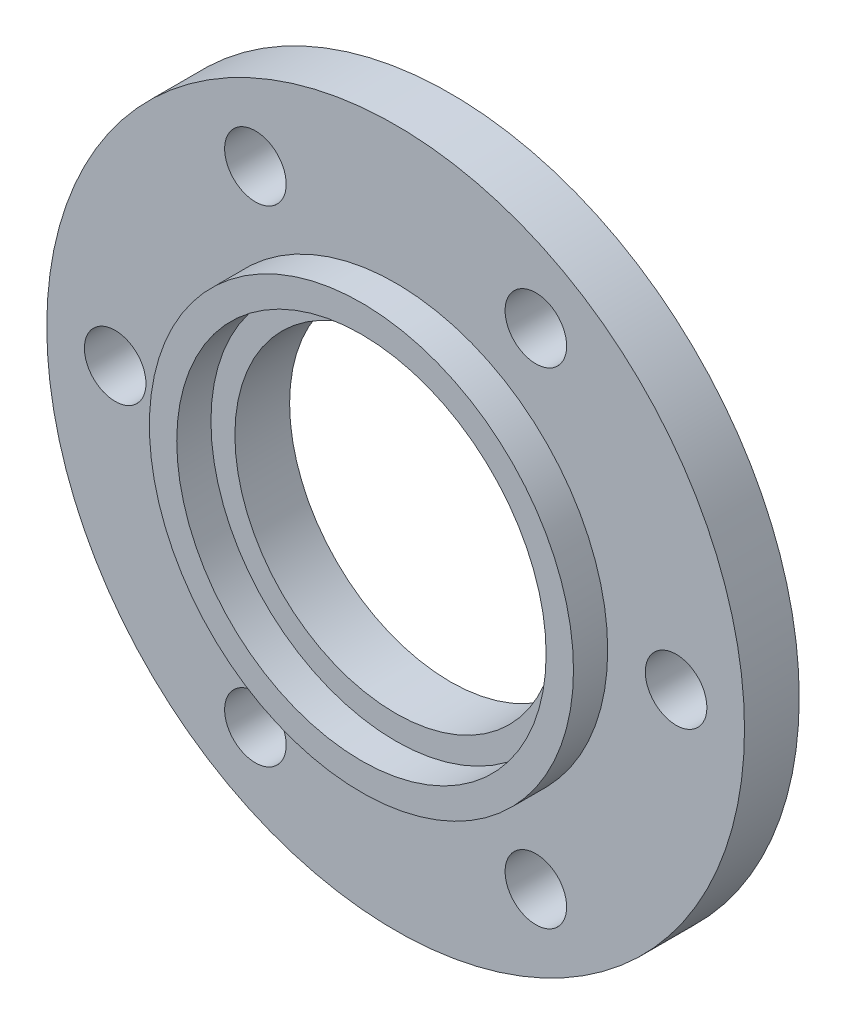
ISO-10303-21;
HEADER;
FILE_DESCRIPTION(('STEP AP214'),'2;1');
FILE_NAME('part.step','',(''),(''),'','','');
FILE_SCHEMA(('AUTOMOTIVE_DESIGN { 1 0 10303 214 1 1 1 1 }'));
ENDSEC;
DATA;
#1=APPLICATION_CONTEXT('core data for automotive mechanical design processes');
#2=APPLICATION_PROTOCOL_DEFINITION('international standard','automotive_design',2000,#1);
#3=PRODUCT_CONTEXT('',#1,'mechanical');
#4=PRODUCT('Part','Part','',(#3));
#5=PRODUCT_RELATED_PRODUCT_CATEGORY('part','',(#4));
#6=PRODUCT_DEFINITION_FORMATION('','',#4);
#7=PRODUCT_DEFINITION_CONTEXT('part definition',#1,'design');
#8=PRODUCT_DEFINITION('design','',#6,#7);
#9=PRODUCT_DEFINITION_SHAPE('','',#8);
#10=(LENGTH_UNIT() NAMED_UNIT(*) SI_UNIT(.MILLI.,.METRE.));
#11=(NAMED_UNIT(*) PLANE_ANGLE_UNIT() SI_UNIT($,.RADIAN.));
#12=(NAMED_UNIT(*) SI_UNIT($,.STERADIAN.) SOLID_ANGLE_UNIT());
#13=UNCERTAINTY_MEASURE_WITH_UNIT(LENGTH_MEASURE(1.E-05),#10,'distance_accuracy_value','');
#14=(GEOMETRIC_REPRESENTATION_CONTEXT(3) GLOBAL_UNCERTAINTY_ASSIGNED_CONTEXT((#13)) GLOBAL_UNIT_ASSIGNED_CONTEXT((#10,
#11,#12)) REPRESENTATION_CONTEXT('',''));
#15=CARTESIAN_POINT('',(0.,0.,0.));
#16=DIRECTION('',(0.,0.,1.));
#17=DIRECTION('',(1.,0.,0.));
#18=AXIS2_PLACEMENT_3D('',#15,#16,#17);
#19=CARTESIAN_POINT('',(0.,0.,8.));
#20=DIRECTION('',(0.,0.,1.));
#21=DIRECTION('',(1.,0.,0.));
#22=AXIS2_PLACEMENT_3D('',#19,#20,#21);
#23=PLANE('',#22);
#24=CARTESIAN_POINT('',(0.,0.,8.));
#25=DIRECTION('',(0.,0.,1.));
#26=DIRECTION('',(1.,0.,0.));
#27=AXIS2_PLACEMENT_3D('',#24,#25,#26);
#28=CIRCLE('',#27,23.5);
#29=CARTESIAN_POINT('',(23.5,0.,8.));
#30=VERTEX_POINT('',#29);
#31=EDGE_CURVE('E55',#30,#30,#28,.T.);
#32=ORIENTED_EDGE('',*,*,#31,.F.);
#33=EDGE_LOOP('',(#32));
#34=FACE_BOUND('',#33,.T.);
#35=CARTESIAN_POINT('',(0.,0.,8.));
#36=DIRECTION('',(0.,0.,1.));
#37=DIRECTION('',(1.,0.,0.));
#38=AXIS2_PLACEMENT_3D('',#35,#36,#37);
#39=CIRCLE('',#38,27.);
#40=CARTESIAN_POINT('',(27.,0.,8.));
#41=VERTEX_POINT('',#40);
#42=EDGE_CURVE('E10',#41,#41,#39,.F.);
#43=ORIENTED_EDGE('',*,*,#42,.F.);
#44=EDGE_LOOP('',(#43));
#45=FACE_BOUND('',#44,.T.);
#46=ADVANCED_FACE('F39',(#34,#45),#23,.T.);
#47=CARTESIAN_POINT('',(41.,0.,8.));
#48=DIRECTION('',(0.,0.,1.));
#49=DIRECTION('',(1.,0.,0.));
#50=AXIS2_PLACEMENT_3D('',#47,#48,#49);
#51=CIRCLE('',#50,4.5);
#52=CARTESIAN_POINT('',(45.5,0.,8.));
#53=VERTEX_POINT('',#52);
#54=EDGE_CURVE('E95',#53,#53,#51,.T.);
#55=ORIENTED_EDGE('',*,*,#54,.F.);
#56=EDGE_LOOP('',(#55));
#57=FACE_BOUND('',#56,.T.);
#58=CARTESIAN_POINT('',(20.5000000000004,35.5070415551617,8.));
#59=DIRECTION('',(0.,0.,1.));
#60=DIRECTION('',(1.,0.,0.));
#61=AXIS2_PLACEMENT_3D('',#58,#59,#60);
#62=CIRCLE('',#61,4.5);
#63=CARTESIAN_POINT('',(25.0000000000004,35.5070415551617,8.));
#64=VERTEX_POINT('',#63);
#65=EDGE_CURVE('E79',#64,#64,#62,.T.);
#66=ORIENTED_EDGE('',*,*,#65,.F.);
#67=EDGE_LOOP('',(#66));
#68=FACE_BOUND('',#67,.T.);
#69=CARTESIAN_POINT('',(-20.4999999999997,35.5070415551622,8.));
#70=DIRECTION('',(0.,0.,1.));
#71=DIRECTION('',(1.,0.,0.));
#72=AXIS2_PLACEMENT_3D('',#69,#70,#71);
#73=CIRCLE('',#72,4.5);
#74=CARTESIAN_POINT('',(-15.9999999999997,35.5070415551622,8.));
#75=VERTEX_POINT('',#74);
#76=EDGE_CURVE('E72',#75,#75,#73,.T.);
#77=ORIENTED_EDGE('',*,*,#76,.F.);
#78=EDGE_LOOP('',(#77));
#79=FACE_BOUND('',#78,.T.);
#80=CARTESIAN_POINT('',(-41.,2.86301469785137E-13,8.));
#81=DIRECTION('',(0.,0.,1.));
#82=DIRECTION('',(1.,0.,0.));
#83=AXIS2_PLACEMENT_3D('',#80,#81,#82);
#84=CIRCLE('',#83,4.5);
#85=CARTESIAN_POINT('',(-36.5,2.86301469785137E-13,8.));
#86=VERTEX_POINT('',#85);
#87=EDGE_CURVE('E80',#86,#86,#84,.T.);
#88=ORIENTED_EDGE('',*,*,#87,.F.);
#89=EDGE_LOOP('',(#88));
#90=FACE_BOUND('',#89,.T.);
#91=CARTESIAN_POINT('',(-20.5000000000002,-35.5070415551619,8.));
#92=DIRECTION('',(0.,0.,1.));
#93=DIRECTION('',(1.,0.,0.));
#94=AXIS2_PLACEMENT_3D('',#91,#92,#93);
#95=CIRCLE('',#94,4.5);
#96=CARTESIAN_POINT('',(-16.0000000000002,-35.5070415551619,8.));
#97=VERTEX_POINT('',#96);
#98=EDGE_CURVE('E86',#97,#97,#95,.T.);
#99=ORIENTED_EDGE('',*,*,#98,.F.);
#100=EDGE_LOOP('',(#99));
#101=FACE_BOUND('',#100,.T.);
#102=CARTESIAN_POINT('',(20.4999999999999,-35.507041555162,8.));
#103=DIRECTION('',(0.,0.,1.));
#104=DIRECTION('',(1.,0.,0.));
#105=AXIS2_PLACEMENT_3D('',#102,#103,#104);
#106=CIRCLE('',#105,4.5);
#107=CARTESIAN_POINT('',(24.9999999999999,-35.507041555162,8.));
#108=VERTEX_POINT('',#107);
#109=EDGE_CURVE('E92',#108,#108,#106,.T.);
#110=ORIENTED_EDGE('',*,*,#109,.F.);
#111=EDGE_LOOP('',(#110));
#112=FACE_BOUND('',#111,.T.);
#113=CARTESIAN_POINT('',(0.,0.,8.));
#114=DIRECTION('',(0.,0.,1.));
#115=DIRECTION('',(1.,0.,0.));
#116=AXIS2_PLACEMENT_3D('',#113,#114,#115);
#117=CIRCLE('',#116,31.);
#118=CARTESIAN_POINT('',(31.,0.,8.));
#119=VERTEX_POINT('',#118);
#120=EDGE_CURVE('E63',#119,#119,#117,.T.);
#121=ORIENTED_EDGE('',*,*,#120,.F.);
#122=EDGE_LOOP('',(#121));
#123=FACE_BOUND('',#122,.T.);
#124=CARTESIAN_POINT('',(0.,0.,8.));
#125=DIRECTION('',(0.,0.,1.));
#126=DIRECTION('',(1.,0.,0.));
#127=AXIS2_PLACEMENT_3D('',#124,#125,#126);
#128=CIRCLE('',#127,51.);
#129=CARTESIAN_POINT('',(51.,0.,8.));
#130=VERTEX_POINT('',#129);
#131=EDGE_CURVE('E46',#130,#130,#128,.T.);
#132=ORIENTED_EDGE('',*,*,#131,.T.);
#133=EDGE_LOOP('',(#132));
#134=FACE_BOUND('',#133,.T.);
#135=ADVANCED_FACE('F111',(#57,#68,#79,#90,#101,#112,#123,#134),#23,.T.);
#136=CARTESIAN_POINT('',(0.,0.,0.));
#137=DIRECTION('',(0.,0.,1.));
#138=DIRECTION('',(1.,0.,0.));
#139=AXIS2_PLACEMENT_3D('',#136,#137,#138);
#140=PLANE('',#139);
#141=CARTESIAN_POINT('',(41.,0.,0.));
#142=DIRECTION('',(0.,0.,1.));
#143=DIRECTION('',(1.,0.,0.));
#144=AXIS2_PLACEMENT_3D('',#141,#142,#143);
#145=CIRCLE('',#144,4.5);
#146=CARTESIAN_POINT('',(45.5,0.,0.));
#147=VERTEX_POINT('',#146);
#148=EDGE_CURVE('E71',#147,#147,#145,.F.);
#149=ORIENTED_EDGE('',*,*,#148,.F.);
#150=EDGE_LOOP('',(#149));
#151=FACE_BOUND('',#150,.T.);
#152=CARTESIAN_POINT('',(20.5000000000004,35.5070415551617,0.));
#153=DIRECTION('',(0.,0.,1.));
#154=DIRECTION('',(1.,0.,0.));
#155=AXIS2_PLACEMENT_3D('',#152,#153,#154);
#156=CIRCLE('',#155,4.5);
#157=CARTESIAN_POINT('',(25.0000000000004,35.5070415551617,0.));
#158=VERTEX_POINT('',#157);
#159=EDGE_CURVE('E100',#158,#158,#156,.F.);
#160=ORIENTED_EDGE('',*,*,#159,.F.);
#161=EDGE_LOOP('',(#160));
#162=FACE_BOUND('',#161,.T.);
#163=CARTESIAN_POINT('',(-20.4999999999997,35.5070415551622,0.));
#164=DIRECTION('',(0.,0.,1.));
#165=DIRECTION('',(1.,0.,0.));
#166=AXIS2_PLACEMENT_3D('',#163,#164,#165);
#167=CIRCLE('',#166,4.5);
#168=CARTESIAN_POINT('',(-15.9999999999997,35.5070415551622,0.));
#169=VERTEX_POINT('',#168);
#170=EDGE_CURVE('E76',#169,#169,#167,.F.);
#171=ORIENTED_EDGE('',*,*,#170,.F.);
#172=EDGE_LOOP('',(#171));
#173=FACE_BOUND('',#172,.T.);
#174=CARTESIAN_POINT('',(-41.,2.86301469785137E-13,0.));
#175=DIRECTION('',(0.,0.,1.));
#176=DIRECTION('',(1.,0.,0.));
#177=AXIS2_PLACEMENT_3D('',#174,#175,#176);
#178=CIRCLE('',#177,4.5);
#179=CARTESIAN_POINT('',(-36.5,2.86301469785137E-13,0.));
#180=VERTEX_POINT('',#179);
#181=EDGE_CURVE('E75',#180,#180,#178,.F.);
#182=ORIENTED_EDGE('',*,*,#181,.F.);
#183=EDGE_LOOP('',(#182));
#184=FACE_BOUND('',#183,.T.);
#185=CARTESIAN_POINT('',(-20.5000000000002,-35.5070415551619,0.));
#186=DIRECTION('',(0.,0.,1.));
#187=DIRECTION('',(1.,0.,0.));
#188=AXIS2_PLACEMENT_3D('',#185,#186,#187);
#189=CIRCLE('',#188,4.5);
#190=CARTESIAN_POINT('',(-16.0000000000002,-35.5070415551619,0.));
#191=VERTEX_POINT('',#190);
#192=EDGE_CURVE('E83',#191,#191,#189,.F.);
#193=ORIENTED_EDGE('',*,*,#192,.F.);
#194=EDGE_LOOP('',(#193));
#195=FACE_BOUND('',#194,.T.);
#196=CARTESIAN_POINT('',(20.4999999999999,-35.507041555162,0.));
#197=DIRECTION('',(0.,0.,1.));
#198=DIRECTION('',(1.,0.,0.));
#199=AXIS2_PLACEMENT_3D('',#196,#197,#198);
#200=CIRCLE('',#199,4.5);
#201=CARTESIAN_POINT('',(24.9999999999999,-35.507041555162,0.));
#202=VERTEX_POINT('',#201);
#203=EDGE_CURVE('E89',#202,#202,#200,.F.);
#204=ORIENTED_EDGE('',*,*,#203,.F.);
#205=EDGE_LOOP('',(#204));
#206=FACE_BOUND('',#205,.T.);
#207=CARTESIAN_POINT('',(0.,0.,0.));
#208=DIRECTION('',(0.,0.,1.));
#209=DIRECTION('',(1.,0.,0.));
#210=AXIS2_PLACEMENT_3D('',#207,#208,#209);
#211=CIRCLE('',#210,51.);
#212=CARTESIAN_POINT('',(51.,0.,0.));
#213=VERTEX_POINT('',#212);
#214=EDGE_CURVE('E50',#213,#213,#211,.T.);
#215=ORIENTED_EDGE('',*,*,#214,.F.);
#216=EDGE_LOOP('',(#215));
#217=FACE_BOUND('',#216,.T.);
#218=CARTESIAN_POINT('',(0.,0.,0.));
#219=DIRECTION('',(0.,0.,1.));
#220=DIRECTION('',(1.,0.,0.));
#221=AXIS2_PLACEMENT_3D('',#218,#219,#220);
#222=CIRCLE('',#221,23.5);
#223=CARTESIAN_POINT('',(23.5,0.,0.));
#224=VERTEX_POINT('',#223);
#225=EDGE_CURVE('E57',#224,#224,#222,.T.);
#226=ORIENTED_EDGE('',*,*,#225,.T.);
#227=EDGE_LOOP('',(#226));
#228=FACE_BOUND('',#227,.T.);
#229=ADVANCED_FACE('F114',(#151,#162,#173,#184,#195,#206,#217,#228),#140,.F.);
#230=CARTESIAN_POINT('',(0.,0.,8.));
#231=DIRECTION('',(0.,0.,-1.));
#232=DIRECTION('',(-1.,0.,0.));
#233=AXIS2_PLACEMENT_3D('',#230,#231,#232);
#234=CYLINDRICAL_SURFACE('',#233,51.);
#235=ORIENTED_EDGE('',*,*,#131,.F.);
#236=EDGE_LOOP('',(#235));
#237=FACE_BOUND('',#236,.T.);
#238=ORIENTED_EDGE('',*,*,#214,.T.);
#239=EDGE_LOOP('',(#238));
#240=FACE_BOUND('',#239,.T.);
#241=ADVANCED_FACE('F41',(#237,#240),#234,.T.);
#242=CARTESIAN_POINT('',(0.,0.,8.));
#243=DIRECTION('',(0.,0.,-1.));
#244=DIRECTION('',(-1.,0.,0.));
#245=AXIS2_PLACEMENT_3D('',#242,#243,#244);
#246=CYLINDRICAL_SURFACE('',#245,23.5);
#247=ORIENTED_EDGE('',*,*,#31,.T.);
#248=EDGE_LOOP('',(#247));
#249=FACE_BOUND('',#248,.T.);
#250=ORIENTED_EDGE('',*,*,#225,.F.);
#251=EDGE_LOOP('',(#250));
#252=FACE_BOUND('',#251,.T.);
#253=ADVANCED_FACE('F141',(#249,#252),#246,.F.);
#254=CARTESIAN_POINT('',(0.,0.,13.));
#255=DIRECTION('',(0.,0.,1.));
#256=DIRECTION('',(1.,0.,0.));
#257=AXIS2_PLACEMENT_3D('',#254,#255,#256);
#258=PLANE('',#257);
#259=CARTESIAN_POINT('',(0.,0.,13.));
#260=DIRECTION('',(0.,0.,1.));
#261=DIRECTION('',(1.,0.,0.));
#262=AXIS2_PLACEMENT_3D('',#259,#260,#261);
#263=CIRCLE('',#262,31.);
#264=CARTESIAN_POINT('',(31.,0.,13.));
#265=VERTEX_POINT('',#264);
#266=EDGE_CURVE('E60',#265,#265,#263,.T.);
#267=ORIENTED_EDGE('',*,*,#266,.T.);
#268=EDGE_LOOP('',(#267));
#269=FACE_BOUND('',#268,.T.);
#270=CARTESIAN_POINT('',(0.,0.,13.));
#271=DIRECTION('',(0.,0.,1.));
#272=DIRECTION('',(1.,0.,0.));
#273=AXIS2_PLACEMENT_3D('',#270,#271,#272);
#274=CIRCLE('',#273,27.);
#275=CARTESIAN_POINT('',(27.,0.,13.));
#276=VERTEX_POINT('',#275);
#277=EDGE_CURVE('E66',#276,#276,#274,.T.);
#278=ORIENTED_EDGE('',*,*,#277,.F.);
#279=EDGE_LOOP('',(#278));
#280=FACE_BOUND('',#279,.T.);
#281=ADVANCED_FACE('F131',(#269,#280),#258,.T.);
#282=CARTESIAN_POINT('',(0.,0.,13.));
#283=DIRECTION('',(0.,0.,-1.));
#284=DIRECTION('',(-1.,0.,0.));
#285=AXIS2_PLACEMENT_3D('',#282,#283,#284);
#286=CYLINDRICAL_SURFACE('',#285,31.);
#287=ORIENTED_EDGE('',*,*,#266,.F.);
#288=EDGE_LOOP('',(#287));
#289=FACE_BOUND('',#288,.T.);
#290=ORIENTED_EDGE('',*,*,#120,.T.);
#291=EDGE_LOOP('',(#290));
#292=FACE_BOUND('',#291,.T.);
#293=ADVANCED_FACE('F128',(#289,#292),#286,.T.);
#294=CARTESIAN_POINT('',(0.,0.,13.));
#295=DIRECTION('',(0.,0.,-1.));
#296=DIRECTION('',(-1.,0.,0.));
#297=AXIS2_PLACEMENT_3D('',#294,#295,#296);
#298=CYLINDRICAL_SURFACE('',#297,27.);
#299=ORIENTED_EDGE('',*,*,#277,.T.);
#300=EDGE_LOOP('',(#299));
#301=FACE_BOUND('',#300,.T.);
#302=ORIENTED_EDGE('',*,*,#42,.T.);
#303=EDGE_LOOP('',(#302));
#304=FACE_BOUND('',#303,.T.);
#305=ADVANCED_FACE('F130',(#301,#304),#298,.F.);
#306=CARTESIAN_POINT('',(20.4999999999999,-35.507041555162,-0.000999999999999265));
#307=DIRECTION('',(0.,0.,1.));
#308=DIRECTION('',(1.,0.,0.));
#309=AXIS2_PLACEMENT_3D('',#306,#307,#308);
#310=CYLINDRICAL_SURFACE('',#309,4.5);
#311=ORIENTED_EDGE('',*,*,#109,.T.);
#312=EDGE_LOOP('',(#311));
#313=FACE_BOUND('',#312,.T.);
#314=ORIENTED_EDGE('',*,*,#203,.T.);
#315=EDGE_LOOP('',(#314));
#316=FACE_BOUND('',#315,.T.);
#317=ADVANCED_FACE('F138',(#313,#316),#310,.F.);
#318=CARTESIAN_POINT('',(-20.5000000000002,-35.5070415551619,-0.000999999999999265));
#319=DIRECTION('',(0.,0.,1.));
#320=DIRECTION('',(1.,0.,0.));
#321=AXIS2_PLACEMENT_3D('',#318,#319,#320);
#322=CYLINDRICAL_SURFACE('',#321,4.5);
#323=ORIENTED_EDGE('',*,*,#98,.T.);
#324=EDGE_LOOP('',(#323));
#325=FACE_BOUND('',#324,.T.);
#326=ORIENTED_EDGE('',*,*,#192,.T.);
#327=EDGE_LOOP('',(#326));
#328=FACE_BOUND('',#327,.T.);
#329=ADVANCED_FACE('F214',(#325,#328),#322,.F.);
#330=CARTESIAN_POINT('',(-41.,2.86301469785137E-13,-0.000999999999999265));
#331=DIRECTION('',(0.,0.,1.));
#332=DIRECTION('',(1.,0.,0.));
#333=AXIS2_PLACEMENT_3D('',#330,#331,#332);
#334=CYLINDRICAL_SURFACE('',#333,4.5);
#335=ORIENTED_EDGE('',*,*,#87,.T.);
#336=EDGE_LOOP('',(#335));
#337=FACE_BOUND('',#336,.T.);
#338=ORIENTED_EDGE('',*,*,#181,.T.);
#339=EDGE_LOOP('',(#338));
#340=FACE_BOUND('',#339,.T.);
#341=ADVANCED_FACE('F224',(#337,#340),#334,.F.);
#342=CARTESIAN_POINT('',(-20.4999999999997,35.5070415551622,-0.000999999999999265));
#343=DIRECTION('',(0.,0.,1.));
#344=DIRECTION('',(1.,0.,0.));
#345=AXIS2_PLACEMENT_3D('',#342,#343,#344);
#346=CYLINDRICAL_SURFACE('',#345,4.5);
#347=ORIENTED_EDGE('',*,*,#76,.T.);
#348=EDGE_LOOP('',(#347));
#349=FACE_BOUND('',#348,.T.);
#350=ORIENTED_EDGE('',*,*,#170,.T.);
#351=EDGE_LOOP('',(#350));
#352=FACE_BOUND('',#351,.T.);
#353=ADVANCED_FACE('F234',(#349,#352),#346,.F.);
#354=CARTESIAN_POINT('',(20.5000000000004,35.5070415551617,-0.000999999999999265));
#355=DIRECTION('',(0.,0.,1.));
#356=DIRECTION('',(1.,0.,0.));
#357=AXIS2_PLACEMENT_3D('',#354,#355,#356);
#358=CYLINDRICAL_SURFACE('',#357,4.5);
#359=ORIENTED_EDGE('',*,*,#65,.T.);
#360=EDGE_LOOP('',(#359));
#361=FACE_BOUND('',#360,.T.);
#362=ORIENTED_EDGE('',*,*,#159,.T.);
#363=EDGE_LOOP('',(#362));
#364=FACE_BOUND('',#363,.T.);
#365=ADVANCED_FACE('F244',(#361,#364),#358,.F.);
#366=CARTESIAN_POINT('',(41.,0.,-0.000999999999999265));
#367=DIRECTION('',(0.,0.,1.));
#368=DIRECTION('',(1.,0.,0.));
#369=AXIS2_PLACEMENT_3D('',#366,#367,#368);
#370=CYLINDRICAL_SURFACE('',#369,4.5);
#371=ORIENTED_EDGE('',*,*,#54,.T.);
#372=EDGE_LOOP('',(#371));
#373=FACE_BOUND('',#372,.T.);
#374=ORIENTED_EDGE('',*,*,#148,.T.);
#375=EDGE_LOOP('',(#374));
#376=FACE_BOUND('',#375,.T.);
#377=ADVANCED_FACE('F108',(#373,#376),#370,.F.);
#378=CLOSED_SHELL('',(#46,#135,#229,#241,#253,#281,#293,#305,#317,#329,#341,#353,#365,#377));
#379=MANIFOLD_SOLID_BREP('B2',#378);
#380=ADVANCED_BREP_SHAPE_REPRESENTATION('',(#18,#379),#14);
#381=SHAPE_DEFINITION_REPRESENTATION(#9,#380);
ENDSEC;
END-ISO-10303-21;
